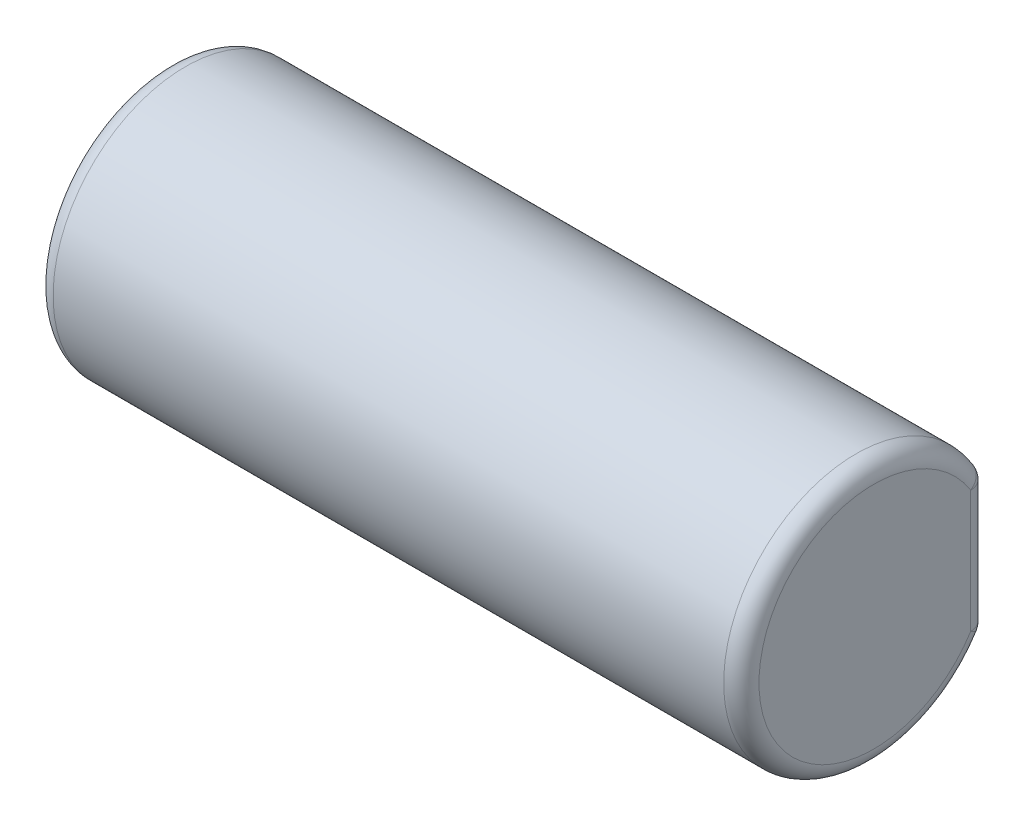
ISO-10303-21;
HEADER;
FILE_DESCRIPTION(('STEP AP214'),'2;1');
FILE_NAME('part.step','',(''),(''),'','','');
FILE_SCHEMA(('AUTOMOTIVE_DESIGN { 1 0 10303 214 1 1 1 1 }'));
ENDSEC;
DATA;
#1=APPLICATION_CONTEXT('core data for automotive mechanical design processes');
#2=APPLICATION_PROTOCOL_DEFINITION('international standard','automotive_design',2000,#1);
#3=PRODUCT_CONTEXT('',#1,'mechanical');
#4=PRODUCT('Part','Part','',(#3));
#5=PRODUCT_RELATED_PRODUCT_CATEGORY('part','',(#4));
#6=PRODUCT_DEFINITION_FORMATION('','',#4);
#7=PRODUCT_DEFINITION_CONTEXT('part definition',#1,'design');
#8=PRODUCT_DEFINITION('design','',#6,#7);
#9=PRODUCT_DEFINITION_SHAPE('','',#8);
#10=(LENGTH_UNIT() NAMED_UNIT(*) SI_UNIT(.MILLI.,.METRE.));
#11=(NAMED_UNIT(*) PLANE_ANGLE_UNIT() SI_UNIT($,.RADIAN.));
#12=(NAMED_UNIT(*) SI_UNIT($,.STERADIAN.) SOLID_ANGLE_UNIT());
#13=UNCERTAINTY_MEASURE_WITH_UNIT(LENGTH_MEASURE(1.E-05),#10,'distance_accuracy_value','');
#14=(GEOMETRIC_REPRESENTATION_CONTEXT(3) GLOBAL_UNCERTAINTY_ASSIGNED_CONTEXT((#13)) GLOBAL_UNIT_ASSIGNED_CONTEXT((#10,
#11,#12)) REPRESENTATION_CONTEXT('',''));
#15=CARTESIAN_POINT('',(0.,0.,0.));
#16=DIRECTION('',(0.,0.,1.));
#17=DIRECTION('',(1.,0.,0.));
#18=AXIS2_PLACEMENT_3D('',#15,#16,#17);
#19=CARTESIAN_POINT('',(20.,0.,-3.25));
#20=DIRECTION('',(0.,0.,-1.));
#21=DIRECTION('',(-1.,0.,0.));
#22=AXIS2_PLACEMENT_3D('',#19,#20,#21);
#23=PLANE('',#22);
#24=DIRECTION('',(1.,0.,0.));
#25=VECTOR('',#24,1.);
#26=CARTESIAN_POINT('',(20.,1.73205080756888,-3.25));
#27=LINE('',#26,#25);
#28=CARTESIAN_POINT('',(0.5,1.73205080756888,-3.25));
#29=VERTEX_POINT('',#28);
#30=CARTESIAN_POINT('',(19.5,1.73205080756888,-3.25));
#31=VERTEX_POINT('',#30);
#32=EDGE_CURVE('E94',#29,#31,#27,.T.);
#33=ORIENTED_EDGE('',*,*,#32,.T.);
#34=DIRECTION('',(0.,-1.,0.));
#35=VECTOR('',#34,1.);
#36=CARTESIAN_POINT('',(19.5,0.,-3.25));
#37=LINE('',#36,#35);
#38=CARTESIAN_POINT('',(19.5,-1.73205080756888,-3.25));
#39=VERTEX_POINT('',#38);
#40=EDGE_CURVE('E126',#31,#39,#37,.T.);
#41=ORIENTED_EDGE('',*,*,#40,.T.);
#42=DIRECTION('',(1.,0.,0.));
#43=VECTOR('',#42,1.);
#44=CARTESIAN_POINT('',(0.,-1.73205080756888,-3.25));
#45=LINE('',#44,#43);
#46=CARTESIAN_POINT('',(0.5,-1.73205080756888,-3.25));
#47=VERTEX_POINT('',#46);
#48=EDGE_CURVE('E123',#39,#47,#45,.F.);
#49=ORIENTED_EDGE('',*,*,#48,.T.);
#50=DIRECTION('',(0.,-1.,0.));
#51=VECTOR('',#50,1.);
#52=CARTESIAN_POINT('',(0.5,1.87082869338697,-3.25));
#53=LINE('',#52,#51);
#54=EDGE_CURVE('E118',#47,#29,#53,.F.);
#55=ORIENTED_EDGE('',*,*,#54,.T.);
#56=EDGE_LOOP('',(#33,#41,#49,#55));
#57=FACE_BOUND('',#56,.T.);
#58=ADVANCED_FACE('F33',(#57),#23,.T.);
#59=CARTESIAN_POINT('',(20.,0.,0.));
#60=DIRECTION('',(-1.,0.,0.));
#61=DIRECTION('',(0.,0.,1.));
#62=AXIS2_PLACEMENT_3D('',#59,#60,#61);
#63=CYLINDRICAL_SURFACE('',#62,3.75);
#64=DIRECTION('',(-1.,0.,0.));
#65=VECTOR('',#64,1.);
#66=CARTESIAN_POINT('',(20.,-1.99852016257947,-3.17307692307692));
#67=LINE('',#66,#65);
#68=CARTESIAN_POINT('',(0.5,-1.99852016257947,-3.17307692307692));
#69=VERTEX_POINT('',#68);
#70=CARTESIAN_POINT('',(19.5,-1.99852016257947,-3.17307692307692));
#71=VERTEX_POINT('',#70);
#72=EDGE_CURVE('E111',#69,#71,#67,.F.);
#73=ORIENTED_EDGE('',*,*,#72,.T.);
#74=CARTESIAN_POINT('',(19.5,0.,0.));
#75=DIRECTION('',(1.,0.,0.));
#76=DIRECTION('',(0.,0.,-1.));
#77=AXIS2_PLACEMENT_3D('',#74,#75,#76);
#78=CIRCLE('',#77,3.75);
#79=CARTESIAN_POINT('',(19.5,1.99852016257947,-3.17307692307692));
#80=VERTEX_POINT('',#79);
#81=EDGE_CURVE('E115',#71,#80,#78,.F.);
#82=ORIENTED_EDGE('',*,*,#81,.T.);
#83=DIRECTION('',(-1.,0.,0.));
#84=VECTOR('',#83,1.);
#85=CARTESIAN_POINT('',(20.,1.99852016257947,-3.17307692307692));
#86=LINE('',#85,#84);
#87=CARTESIAN_POINT('',(0.5,1.99852016257947,-3.17307692307692));
#88=VERTEX_POINT('',#87);
#89=EDGE_CURVE('E92',#80,#88,#86,.T.);
#90=ORIENTED_EDGE('',*,*,#89,.T.);
#91=CARTESIAN_POINT('',(0.5,0.,0.));
#92=DIRECTION('',(1.,0.,0.));
#93=DIRECTION('',(0.,0.,-1.));
#94=AXIS2_PLACEMENT_3D('',#91,#92,#93);
#95=CIRCLE('',#94,3.75);
#96=EDGE_CURVE('E105',#88,#69,#95,.T.);
#97=ORIENTED_EDGE('',*,*,#96,.T.);
#98=EDGE_LOOP('',(#73,#82,#90,#97));
#99=FACE_BOUND('',#98,.T.);
#100=ADVANCED_FACE('F113',(#99),#63,.T.);
#101=CARTESIAN_POINT('',(20.,0.,0.));
#102=DIRECTION('',(1.,0.,0.));
#103=DIRECTION('',(0.,0.,-1.));
#104=AXIS2_PLACEMENT_3D('',#101,#102,#103);
#105=PLANE('',#104);
#106=DIRECTION('',(0.,-1.,0.));
#107=VECTOR('',#106,1.);
#108=CARTESIAN_POINT('',(20.,0.,-2.75));
#109=LINE('',#108,#107);
#110=CARTESIAN_POINT('',(20.,-1.73205080756888,-2.75));
#111=VERTEX_POINT('',#110);
#112=CARTESIAN_POINT('',(20.,1.73205080756888,-2.75));
#113=VERTEX_POINT('',#112);
#114=EDGE_CURVE('E128',#111,#113,#109,.F.);
#115=ORIENTED_EDGE('',*,*,#114,.T.);
#116=CARTESIAN_POINT('',(20.,0.,0.));
#117=DIRECTION('',(1.,0.,0.));
#118=DIRECTION('',(0.,0.,-1.));
#119=AXIS2_PLACEMENT_3D('',#116,#117,#118);
#120=CIRCLE('',#119,3.25);
#121=EDGE_CURVE('E130',#113,#111,#120,.T.);
#122=ORIENTED_EDGE('',*,*,#121,.T.);
#123=EDGE_LOOP('',(#115,#122));
#124=FACE_BOUND('',#123,.T.);
#125=ADVANCED_FACE('F168',(#124),#105,.T.);
#126=CARTESIAN_POINT('',(0.,0.,0.));
#127=DIRECTION('',(1.,0.,0.));
#128=DIRECTION('',(0.,0.,-1.));
#129=AXIS2_PLACEMENT_3D('',#126,#127,#128);
#130=PLANE('',#129);
#131=DIRECTION('',(0.,-1.,0.));
#132=VECTOR('',#131,1.);
#133=CARTESIAN_POINT('',(0.,-1.87082869338697,-2.75));
#134=LINE('',#133,#132);
#135=CARTESIAN_POINT('',(0.,1.73205080756888,-2.75));
#136=VERTEX_POINT('',#135);
#137=CARTESIAN_POINT('',(0.,-1.73205080756888,-2.75));
#138=VERTEX_POINT('',#137);
#139=EDGE_CURVE('E42',#136,#138,#134,.T.);
#140=ORIENTED_EDGE('',*,*,#139,.T.);
#141=CARTESIAN_POINT('',(0.,0.,0.));
#142=DIRECTION('',(1.,0.,0.));
#143=DIRECTION('',(0.,0.,-1.));
#144=AXIS2_PLACEMENT_3D('',#141,#142,#143);
#145=CIRCLE('',#144,3.25);
#146=EDGE_CURVE('E11',#138,#136,#145,.F.);
#147=ORIENTED_EDGE('',*,*,#146,.T.);
#148=EDGE_LOOP('',(#140,#147));
#149=FACE_BOUND('',#148,.T.);
#150=ADVANCED_FACE('F259',(#149),#130,.F.);
#151=CARTESIAN_POINT('',(20.,-1.73205080756888,-2.75));
#152=DIRECTION('',(-1.,0.,0.));
#153=DIRECTION('',(0.,0.,1.));
#154=AXIS2_PLACEMENT_3D('',#151,#152,#153);
#155=CYLINDRICAL_SURFACE('',#154,0.5);
#156=CARTESIAN_POINT('',(19.5,-1.73205080756888,-2.75));
#157=DIRECTION('',(1.,0.,0.));
#158=DIRECTION('',(0.,0.,-1.));
#159=AXIS2_PLACEMENT_3D('',#156,#157,#158);
#160=CIRCLE('',#159,0.5);
#161=EDGE_CURVE('E37',#71,#39,#160,.T.);
#162=ORIENTED_EDGE('',*,*,#161,.F.);
#163=ORIENTED_EDGE('',*,*,#72,.F.);
#164=CARTESIAN_POINT('',(0.5,-1.73205080756888,-2.75));
#165=DIRECTION('',(-1.,0.,0.));
#166=DIRECTION('',(0.,-1.,0.));
#167=AXIS2_PLACEMENT_3D('',#164,#165,#166);
#168=CIRCLE('',#167,0.5);
#169=EDGE_CURVE('E149',#47,#69,#168,.T.);
#170=ORIENTED_EDGE('',*,*,#169,.F.);
#171=ORIENTED_EDGE('',*,*,#48,.F.);
#172=EDGE_LOOP('',(#162,#163,#170,#171));
#173=FACE_BOUND('',#172,.T.);
#174=ADVANCED_FACE('F35',(#173),#155,.T.);
#175=CARTESIAN_POINT('',(19.5,-1.73205080756888,-2.75));
#176=DIRECTION('',(0.,0.,1.));
#177=DIRECTION('',(1.,0.,0.));
#178=AXIS2_PLACEMENT_3D('',#175,#176,#177);
#179=SPHERICAL_SURFACE('',#178,0.5);
#180=CARTESIAN_POINT('',(19.5,-1.73205080756888,-2.75));
#181=DIRECTION('',(0.,0.846153846153847,-0.532938710021192));
#182=DIRECTION('',(0.,0.532938710021192,0.846153846153847));
#183=AXIS2_PLACEMENT_3D('',#180,#181,#182);
#184=CIRCLE('',#183,0.5);
#185=EDGE_CURVE('E144',#71,#111,#184,.F.);
#186=ORIENTED_EDGE('',*,*,#185,.F.);
#187=ORIENTED_EDGE('',*,*,#161,.T.);
#188=CARTESIAN_POINT('',(19.5,-1.73205080756888,-2.75));
#189=DIRECTION('',(0.,-1.,0.));
#190=DIRECTION('',(1.,0.,0.));
#191=AXIS2_PLACEMENT_3D('',#188,#189,#190);
#192=CIRCLE('',#191,0.5);
#193=EDGE_CURVE('E147',#111,#39,#192,.F.);
#194=ORIENTED_EDGE('',*,*,#193,.F.);
#195=EDGE_LOOP('',(#186,#187,#194));
#196=FACE_BOUND('',#195,.T.);
#197=ADVANCED_FACE('F159',(#196),#179,.T.);
#198=CARTESIAN_POINT('',(0.5,-1.73205080756888,-2.75));
#199=DIRECTION('',(0.,0.,1.));
#200=DIRECTION('',(1.,0.,0.));
#201=AXIS2_PLACEMENT_3D('',#198,#199,#200);
#202=SPHERICAL_SURFACE('',#201,0.5);
#203=CARTESIAN_POINT('',(0.5,-1.73205080756888,-2.75));
#204=DIRECTION('',(0.,-1.,0.));
#205=DIRECTION('',(0.,0.,-1.));
#206=AXIS2_PLACEMENT_3D('',#203,#204,#205);
#207=CIRCLE('',#206,0.5);
#208=EDGE_CURVE('E141',#47,#138,#207,.F.);
#209=ORIENTED_EDGE('',*,*,#208,.F.);
#210=ORIENTED_EDGE('',*,*,#169,.T.);
#211=CARTESIAN_POINT('',(0.5,-1.73205080756888,-2.75));
#212=DIRECTION('',(0.,0.846153846153846,-0.532938710021193));
#213=DIRECTION('',(0.,0.532938710021193,0.846153846153846));
#214=AXIS2_PLACEMENT_3D('',#211,#212,#213);
#215=CIRCLE('',#214,0.5);
#216=EDGE_CURVE('E108',#138,#69,#215,.F.);
#217=ORIENTED_EDGE('',*,*,#216,.F.);
#218=EDGE_LOOP('',(#209,#210,#217));
#219=FACE_BOUND('',#218,.T.);
#220=ADVANCED_FACE('F235',(#219),#202,.T.);
#221=CARTESIAN_POINT('',(19.5,0.,-2.75));
#222=DIRECTION('',(0.,-1.,0.));
#223=DIRECTION('',(0.,0.,-1.));
#224=AXIS2_PLACEMENT_3D('',#221,#222,#223);
#225=CYLINDRICAL_SURFACE('',#224,0.5);
#226=ORIENTED_EDGE('',*,*,#193,.T.);
#227=ORIENTED_EDGE('',*,*,#40,.F.);
#228=CARTESIAN_POINT('',(19.5,1.73205080756888,-2.75));
#229=DIRECTION('',(0.,1.,0.));
#230=DIRECTION('',(0.,0.,1.));
#231=AXIS2_PLACEMENT_3D('',#228,#229,#230);
#232=CIRCLE('',#231,0.5);
#233=EDGE_CURVE('E138',#113,#31,#232,.T.);
#234=ORIENTED_EDGE('',*,*,#233,.F.);
#235=ORIENTED_EDGE('',*,*,#114,.F.);
#236=EDGE_LOOP('',(#226,#227,#234,#235));
#237=FACE_BOUND('',#236,.T.);
#238=ADVANCED_FACE('F164',(#237),#225,.T.);
#239=CARTESIAN_POINT('',(19.5,0.,0.));
#240=DIRECTION('',(1.,0.,0.));
#241=DIRECTION('',(0.,0.,-1.));
#242=AXIS2_PLACEMENT_3D('',#239,#240,#241);
#243=TOROIDAL_SURFACE('',#242,3.25,0.5);
#244=ORIENTED_EDGE('',*,*,#185,.T.);
#245=ORIENTED_EDGE('',*,*,#121,.F.);
#246=CARTESIAN_POINT('',(19.5,1.73205080756888,-2.75));
#247=DIRECTION('',(0.,-0.846153846153846,-0.532938710021193));
#248=DIRECTION('',(0.,0.532938710021193,-0.846153846153846));
#249=AXIS2_PLACEMENT_3D('',#246,#247,#248);
#250=CIRCLE('',#249,0.5);
#251=EDGE_CURVE('E102',#80,#113,#250,.T.);
#252=ORIENTED_EDGE('',*,*,#251,.F.);
#253=ORIENTED_EDGE('',*,*,#81,.F.);
#254=EDGE_LOOP('',(#244,#245,#252,#253));
#255=FACE_BOUND('',#254,.T.);
#256=ADVANCED_FACE('F170',(#255),#243,.T.);
#257=CARTESIAN_POINT('',(0.5,0.,0.));
#258=DIRECTION('',(1.,0.,0.));
#259=DIRECTION('',(0.,0.,-1.));
#260=AXIS2_PLACEMENT_3D('',#257,#258,#259);
#261=TOROIDAL_SURFACE('',#260,3.25,0.5);
#262=ORIENTED_EDGE('',*,*,#216,.T.);
#263=ORIENTED_EDGE('',*,*,#96,.F.);
#264=CARTESIAN_POINT('',(0.5,1.73205080756888,-2.75));
#265=DIRECTION('',(0.,-0.846153846153847,-0.532938710021192));
#266=DIRECTION('',(0.,0.532938710021192,-0.846153846153847));
#267=AXIS2_PLACEMENT_3D('',#264,#265,#266);
#268=CIRCLE('',#267,0.5);
#269=EDGE_CURVE('E97',#136,#88,#268,.T.);
#270=ORIENTED_EDGE('',*,*,#269,.F.);
#271=ORIENTED_EDGE('',*,*,#146,.F.);
#272=EDGE_LOOP('',(#262,#263,#270,#271));
#273=FACE_BOUND('',#272,.T.);
#274=ADVANCED_FACE('F106',(#273),#261,.T.);
#275=CARTESIAN_POINT('',(0.5,0.,-2.75));
#276=DIRECTION('',(0.,1.,0.));
#277=DIRECTION('',(0.,0.,1.));
#278=AXIS2_PLACEMENT_3D('',#275,#276,#277);
#279=CYLINDRICAL_SURFACE('',#278,0.5);
#280=ORIENTED_EDGE('',*,*,#208,.T.);
#281=ORIENTED_EDGE('',*,*,#139,.F.);
#282=CARTESIAN_POINT('',(0.5,1.73205080756888,-2.75));
#283=DIRECTION('',(0.,1.,0.));
#284=DIRECTION('',(-1.,0.,0.));
#285=AXIS2_PLACEMENT_3D('',#282,#283,#284);
#286=CIRCLE('',#285,0.5);
#287=EDGE_CURVE('E55',#29,#136,#286,.T.);
#288=ORIENTED_EDGE('',*,*,#287,.F.);
#289=ORIENTED_EDGE('',*,*,#54,.F.);
#290=EDGE_LOOP('',(#280,#281,#288,#289));
#291=FACE_BOUND('',#290,.T.);
#292=ADVANCED_FACE('F175',(#291),#279,.T.);
#293=CARTESIAN_POINT('',(19.5,1.73205080756888,-2.75));
#294=DIRECTION('',(0.,0.,1.));
#295=DIRECTION('',(1.,0.,0.));
#296=AXIS2_PLACEMENT_3D('',#293,#294,#295);
#297=SPHERICAL_SURFACE('',#296,0.5);
#298=ORIENTED_EDGE('',*,*,#251,.T.);
#299=ORIENTED_EDGE('',*,*,#233,.T.);
#300=CARTESIAN_POINT('',(19.5,1.73205080756888,-2.75));
#301=DIRECTION('',(1.,0.,0.));
#302=DIRECTION('',(0.,0.,-1.));
#303=AXIS2_PLACEMENT_3D('',#300,#301,#302);
#304=CIRCLE('',#303,0.5);
#305=EDGE_CURVE('E95',#80,#31,#304,.F.);
#306=ORIENTED_EDGE('',*,*,#305,.F.);
#307=EDGE_LOOP('',(#298,#299,#306));
#308=FACE_BOUND('',#307,.T.);
#309=ADVANCED_FACE('F173',(#308),#297,.T.);
#310=CARTESIAN_POINT('',(0.5,1.73205080756888,-2.75));
#311=DIRECTION('',(0.,0.,1.));
#312=DIRECTION('',(1.,0.,0.));
#313=AXIS2_PLACEMENT_3D('',#310,#311,#312);
#314=SPHERICAL_SURFACE('',#313,0.5);
#315=ORIENTED_EDGE('',*,*,#287,.T.);
#316=ORIENTED_EDGE('',*,*,#269,.T.);
#317=CARTESIAN_POINT('',(0.5,1.73205080756888,-2.75));
#318=DIRECTION('',(-1.,0.,0.));
#319=DIRECTION('',(0.,-1.,0.));
#320=AXIS2_PLACEMENT_3D('',#317,#318,#319);
#321=CIRCLE('',#320,0.5);
#322=EDGE_CURVE('E89',#29,#88,#321,.F.);
#323=ORIENTED_EDGE('',*,*,#322,.F.);
#324=EDGE_LOOP('',(#315,#316,#323));
#325=FACE_BOUND('',#324,.T.);
#326=ADVANCED_FACE('F99',(#325),#314,.T.);
#327=CARTESIAN_POINT('',(20.,1.73205080756888,-2.75));
#328=DIRECTION('',(-1.,0.,0.));
#329=DIRECTION('',(0.,0.,1.));
#330=AXIS2_PLACEMENT_3D('',#327,#328,#329);
#331=CYLINDRICAL_SURFACE('',#330,0.5);
#332=ORIENTED_EDGE('',*,*,#305,.T.);
#333=ORIENTED_EDGE('',*,*,#32,.F.);
#334=ORIENTED_EDGE('',*,*,#322,.T.);
#335=ORIENTED_EDGE('',*,*,#89,.F.);
#336=EDGE_LOOP('',(#332,#333,#334,#335));
#337=FACE_BOUND('',#336,.T.);
#338=ADVANCED_FACE('F90',(#337),#331,.T.);
#339=CLOSED_SHELL('',(#58,#100,#125,#150,#174,#197,#220,#238,#256,#274,#292,#309,#326,#338));
#340=MANIFOLD_SOLID_BREP('B2',#339);
#341=ADVANCED_BREP_SHAPE_REPRESENTATION('',(#18,#340),#14);
#342=SHAPE_DEFINITION_REPRESENTATION(#9,#341);
ENDSEC;
END-ISO-10303-21;
